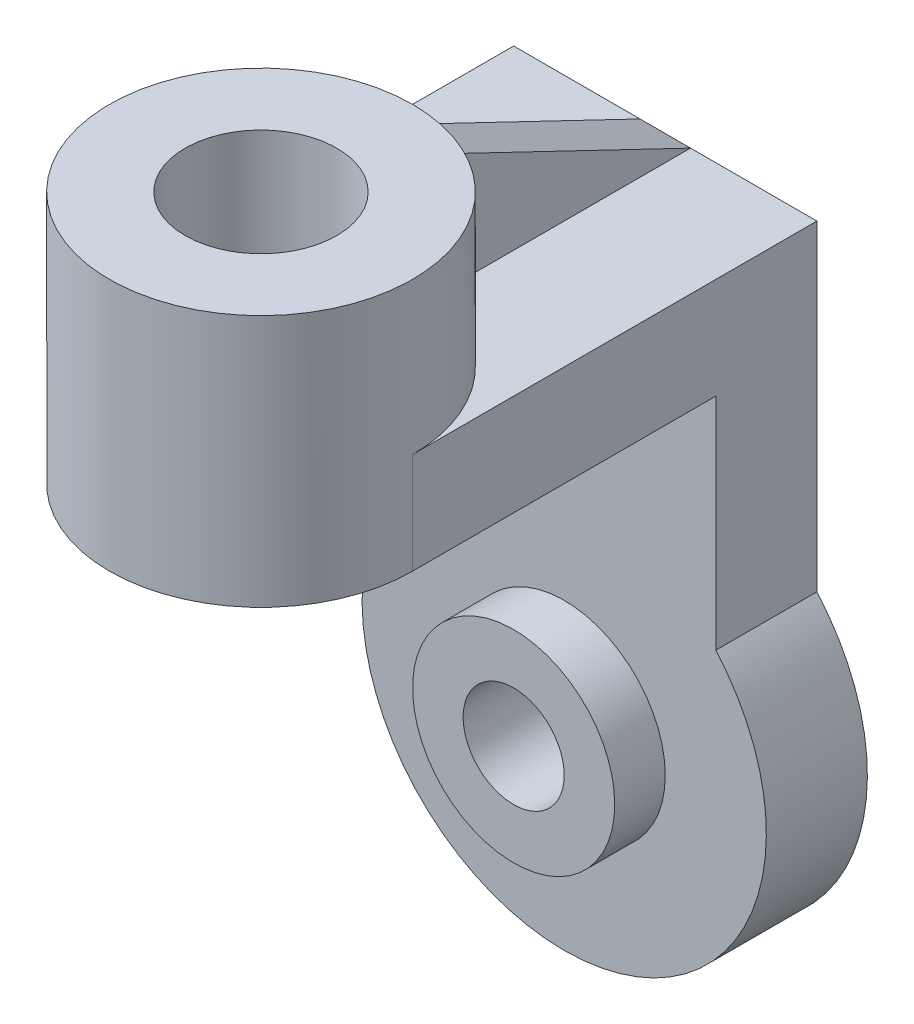
ISO-10303-21;
HEADER;
FILE_DESCRIPTION(('STEP AP214'),'2;1');
FILE_NAME('part.step','',(''),(''),'','','');
FILE_SCHEMA(('AUTOMOTIVE_DESIGN { 1 0 10303 214 1 1 1 1 }'));
ENDSEC;
DATA;
#1=APPLICATION_CONTEXT('core data for automotive mechanical design processes');
#2=APPLICATION_PROTOCOL_DEFINITION('international standard','automotive_design',2000,#1);
#3=PRODUCT_CONTEXT('',#1,'mechanical');
#4=PRODUCT('Part','Part','',(#3));
#5=PRODUCT_RELATED_PRODUCT_CATEGORY('part','',(#4));
#6=PRODUCT_DEFINITION_FORMATION('','',#4);
#7=PRODUCT_DEFINITION_CONTEXT('part definition',#1,'design');
#8=PRODUCT_DEFINITION('design','',#6,#7);
#9=PRODUCT_DEFINITION_SHAPE('','',#8);
#10=(LENGTH_UNIT() NAMED_UNIT(*) SI_UNIT(.MILLI.,.METRE.));
#11=(NAMED_UNIT(*) PLANE_ANGLE_UNIT() SI_UNIT($,.RADIAN.));
#12=(NAMED_UNIT(*) SI_UNIT($,.STERADIAN.) SOLID_ANGLE_UNIT());
#13=UNCERTAINTY_MEASURE_WITH_UNIT(LENGTH_MEASURE(1.E-05),#10,'distance_accuracy_value','');
#14=(GEOMETRIC_REPRESENTATION_CONTEXT(3) GLOBAL_UNCERTAINTY_ASSIGNED_CONTEXT((#13)) GLOBAL_UNIT_ASSIGNED_CONTEXT((#10,
#11,#12)) REPRESENTATION_CONTEXT('',''));
#15=CARTESIAN_POINT('',(0.,0.,0.));
#16=DIRECTION('',(0.,0.,1.));
#17=DIRECTION('',(1.,0.,0.));
#18=AXIS2_PLACEMENT_3D('',#15,#16,#17);
#19=CARTESIAN_POINT('',(0.,45.,0.));
#20=DIRECTION('',(0.,1.,0.));
#21=DIRECTION('',(0.,0.,1.));
#22=AXIS2_PLACEMENT_3D('',#19,#20,#21);
#23=PLANE('',#22);
#24=CARTESIAN_POINT('',(0.,45.,35.));
#25=DIRECTION('',(0.,1.,0.));
#26=DIRECTION('',(0.,0.,1.));
#27=AXIS2_PLACEMENT_3D('',#24,#25,#26);
#28=CIRCLE('',#27,15.);
#29=CARTESIAN_POINT('',(-2.5,45.,20.209800542251));
#30=VERTEX_POINT('',#29);
#31=CARTESIAN_POINT('',(-15.,45.,35.));
#32=VERTEX_POINT('',#31);
#33=EDGE_CURVE('E138',#30,#32,#28,.T.);
#34=ORIENTED_EDGE('',*,*,#33,.F.);
#35=DIRECTION('',(0.,0.,-1.));
#36=VECTOR('',#35,1.);
#37=CARTESIAN_POINT('',(-2.5,45.,0.));
#38=LINE('',#37,#36);
#39=CARTESIAN_POINT('',(-2.5,45.,-5.));
#40=VERTEX_POINT('',#39);
#41=EDGE_CURVE('E52',#30,#40,#38,.T.);
#42=ORIENTED_EDGE('',*,*,#41,.T.);
#43=DIRECTION('',(-1.,0.,0.));
#44=VECTOR('',#43,1.);
#45=CARTESIAN_POINT('',(-15.,45.,-5.));
#46=LINE('',#45,#44);
#47=CARTESIAN_POINT('',(-15.,45.,-5.));
#48=VERTEX_POINT('',#47);
#49=EDGE_CURVE('E136',#40,#48,#46,.T.);
#50=ORIENTED_EDGE('',*,*,#49,.T.);
#51=DIRECTION('',(0.,0.,1.));
#52=VECTOR('',#51,1.);
#53=CARTESIAN_POINT('',(-15.,45.,-5.));
#54=LINE('',#53,#52);
#55=EDGE_CURVE('E150',#48,#32,#54,.T.);
#56=ORIENTED_EDGE('',*,*,#55,.T.);
#57=EDGE_LOOP('',(#34,#42,#50,#56));
#58=FACE_BOUND('',#57,.T.);
#59=ADVANCED_FACE('F35',(#58),#23,.T.);
#60=CARTESIAN_POINT('',(0.,0.,5.));
#61=DIRECTION('',(0.,0.,1.));
#62=DIRECTION('',(1.,0.,0.));
#63=AXIS2_PLACEMENT_3D('',#60,#61,#62);
#64=PLANE('',#63);
#65=CARTESIAN_POINT('',(0.,0.,5.));
#66=DIRECTION('',(0.,0.,1.));
#67=DIRECTION('',(1.,0.,0.));
#68=AXIS2_PLACEMENT_3D('',#65,#66,#67);
#69=CIRCLE('',#68,10.);
#70=CARTESIAN_POINT('',(10.,0.,5.));
#71=VERTEX_POINT('',#70);
#72=EDGE_CURVE('E178',#71,#71,#69,.F.);
#73=ORIENTED_EDGE('',*,*,#72,.T.);
#74=EDGE_LOOP('',(#73));
#75=FACE_BOUND('',#74,.T.);
#76=CARTESIAN_POINT('',(0.,0.,5.));
#77=DIRECTION('',(0.,0.,1.));
#78=DIRECTION('',(1.,0.,0.));
#79=AXIS2_PLACEMENT_3D('',#76,#77,#78);
#80=CIRCLE('',#79,20.);
#81=CARTESIAN_POINT('',(-15.,13.228756555323,5.));
#82=VERTEX_POINT('',#81);
#83=CARTESIAN_POINT('',(15.,13.228756555323,5.));
#84=VERTEX_POINT('',#83);
#85=EDGE_CURVE('E79',#82,#84,#80,.T.);
#86=ORIENTED_EDGE('',*,*,#85,.T.);
#87=DIRECTION('',(0.,1.,0.));
#88=VECTOR('',#87,1.);
#89=CARTESIAN_POINT('',(15.,35.,5.));
#90=LINE('',#89,#88);
#91=CARTESIAN_POINT('',(15.,35.,5.));
#92=VERTEX_POINT('',#91);
#93=EDGE_CURVE('E184',#84,#92,#90,.T.);
#94=ORIENTED_EDGE('',*,*,#93,.T.);
#95=DIRECTION('',(-1.,0.,0.));
#96=VECTOR('',#95,1.);
#97=CARTESIAN_POINT('',(-15.,35.,5.));
#98=LINE('',#97,#96);
#99=CARTESIAN_POINT('',(-15.,35.,5.));
#100=VERTEX_POINT('',#99);
#101=EDGE_CURVE('E61',#92,#100,#98,.T.);
#102=ORIENTED_EDGE('',*,*,#101,.T.);
#103=DIRECTION('',(0.,-1.,0.));
#104=VECTOR('',#103,1.);
#105=CARTESIAN_POINT('',(-15.,35.,5.));
#106=LINE('',#105,#104);
#107=EDGE_CURVE('E185',#100,#82,#106,.T.);
#108=ORIENTED_EDGE('',*,*,#107,.T.);
#109=EDGE_LOOP('',(#86,#94,#102,#108));
#110=FACE_BOUND('',#109,.T.);
#111=ADVANCED_FACE('F197',(#75,#110),#64,.T.);
#112=CARTESIAN_POINT('',(0.,0.,-5.));
#113=DIRECTION('',(0.,0.,1.));
#114=DIRECTION('',(1.,0.,0.));
#115=AXIS2_PLACEMENT_3D('',#112,#113,#114);
#116=PLANE('',#115);
#117=CARTESIAN_POINT('',(0.,0.,-5.));
#118=DIRECTION('',(0.,0.,1.));
#119=DIRECTION('',(1.,0.,0.));
#120=AXIS2_PLACEMENT_3D('',#117,#118,#119);
#121=CIRCLE('',#120,10.);
#122=CARTESIAN_POINT('',(10.,0.,-5.));
#123=VERTEX_POINT('',#122);
#124=EDGE_CURVE('E11',#123,#123,#121,.F.);
#125=ORIENTED_EDGE('',*,*,#124,.F.);
#126=EDGE_LOOP('',(#125));
#127=FACE_BOUND('',#126,.T.);
#128=DIRECTION('',(0.,1.,0.));
#129=VECTOR('',#128,1.);
#130=CARTESIAN_POINT('',(15.,35.,-5.));
#131=LINE('',#130,#129);
#132=CARTESIAN_POINT('',(15.,13.228756555323,-5.));
#133=VERTEX_POINT('',#132);
#134=CARTESIAN_POINT('',(15.,45.,-5.));
#135=VERTEX_POINT('',#134);
#136=EDGE_CURVE('E194',#133,#135,#131,.T.);
#137=ORIENTED_EDGE('',*,*,#136,.F.);
#138=CARTESIAN_POINT('',(0.,0.,-5.));
#139=DIRECTION('',(0.,0.,1.));
#140=DIRECTION('',(1.,0.,0.));
#141=AXIS2_PLACEMENT_3D('',#138,#139,#140);
#142=CIRCLE('',#141,20.);
#143=CARTESIAN_POINT('',(-15.,13.228756555323,-5.));
#144=VERTEX_POINT('',#143);
#145=EDGE_CURVE('E76',#144,#133,#142,.T.);
#146=ORIENTED_EDGE('',*,*,#145,.F.);
#147=DIRECTION('',(0.,-1.,0.));
#148=VECTOR('',#147,1.);
#149=CARTESIAN_POINT('',(-15.,35.,-5.));
#150=LINE('',#149,#148);
#151=EDGE_CURVE('E143',#48,#144,#150,.T.);
#152=ORIENTED_EDGE('',*,*,#151,.F.);
#153=ORIENTED_EDGE('',*,*,#49,.F.);
#154=DIRECTION('',(-1.,0.,0.));
#155=VECTOR('',#154,1.);
#156=CARTESIAN_POINT('',(0.,45.,-5.));
#157=LINE('',#156,#155);
#158=CARTESIAN_POINT('',(2.5,45.,-5.));
#159=VERTEX_POINT('',#158);
#160=EDGE_CURVE('E117',#159,#40,#157,.T.);
#161=ORIENTED_EDGE('',*,*,#160,.F.);
#162=EDGE_CURVE('E145',#135,#159,#46,.T.);
#163=ORIENTED_EDGE('',*,*,#162,.F.);
#164=EDGE_LOOP('',(#137,#146,#152,#153,#161,#163));
#165=FACE_BOUND('',#164,.T.);
#166=ADVANCED_FACE('F141',(#127,#165),#116,.F.);
#167=CARTESIAN_POINT('',(-15.,35.,5.));
#168=DIRECTION('',(1.,0.,0.));
#169=DIRECTION('',(0.,1.,0.));
#170=AXIS2_PLACEMENT_3D('',#167,#168,#169);
#171=PLANE('',#170);
#172=ORIENTED_EDGE('',*,*,#151,.T.);
#173=DIRECTION('',(0.,0.,-1.));
#174=VECTOR('',#173,1.);
#175=CARTESIAN_POINT('',(-15.,13.228756555323,5.));
#176=LINE('',#175,#174);
#177=EDGE_CURVE('E44',#82,#144,#176,.T.);
#178=ORIENTED_EDGE('',*,*,#177,.F.);
#179=ORIENTED_EDGE('',*,*,#107,.F.);
#180=DIRECTION('',(0.,0.,1.));
#181=VECTOR('',#180,1.);
#182=CARTESIAN_POINT('',(-15.,35.,-5.));
#183=LINE('',#182,#181);
#184=CARTESIAN_POINT('',(-15.,35.,35.));
#185=VERTEX_POINT('',#184);
#186=EDGE_CURVE('E159',#100,#185,#183,.T.);
#187=ORIENTED_EDGE('',*,*,#186,.T.);
#188=DIRECTION('',(0.,-1.,0.));
#189=VECTOR('',#188,1.);
#190=CARTESIAN_POINT('',(-15.,45.,35.));
#191=LINE('',#190,#189);
#192=EDGE_CURVE('E165',#32,#185,#191,.T.);
#193=ORIENTED_EDGE('',*,*,#192,.F.);
#194=ORIENTED_EDGE('',*,*,#55,.F.);
#195=EDGE_LOOP('',(#172,#178,#179,#187,#193,#194));
#196=FACE_BOUND('',#195,.T.);
#197=ADVANCED_FACE('F37',(#196),#171,.F.);
#198=CARTESIAN_POINT('',(0.,0.,5.));
#199=DIRECTION('',(0.,0.,-1.));
#200=DIRECTION('',(-1.,0.,0.));
#201=AXIS2_PLACEMENT_3D('',#198,#199,#200);
#202=CYLINDRICAL_SURFACE('',#201,20.);
#203=DIRECTION('',(0.,0.,-1.));
#204=VECTOR('',#203,1.);
#205=CARTESIAN_POINT('',(15.,13.228756555323,5.));
#206=LINE('',#205,#204);
#207=EDGE_CURVE('E191',#84,#133,#206,.T.);
#208=ORIENTED_EDGE('',*,*,#207,.F.);
#209=ORIENTED_EDGE('',*,*,#85,.F.);
#210=ORIENTED_EDGE('',*,*,#177,.T.);
#211=ORIENTED_EDGE('',*,*,#145,.T.);
#212=EDGE_LOOP('',(#208,#209,#210,#211));
#213=FACE_BOUND('',#212,.T.);
#214=ADVANCED_FACE('F291',(#213),#202,.T.);
#215=CARTESIAN_POINT('',(15.,35.,5.));
#216=DIRECTION('',(-1.,0.,0.));
#217=DIRECTION('',(0.,-1.,0.));
#218=AXIS2_PLACEMENT_3D('',#215,#216,#217);
#219=PLANE('',#218);
#220=ORIENTED_EDGE('',*,*,#136,.T.);
#221=DIRECTION('',(0.,0.,-1.));
#222=VECTOR('',#221,1.);
#223=CARTESIAN_POINT('',(15.,45.,-5.));
#224=LINE('',#223,#222);
#225=CARTESIAN_POINT('',(15.,45.,35.));
#226=VERTEX_POINT('',#225);
#227=EDGE_CURVE('E146',#226,#135,#224,.T.);
#228=ORIENTED_EDGE('',*,*,#227,.F.);
#229=DIRECTION('',(0.,-1.,0.));
#230=VECTOR('',#229,1.);
#231=CARTESIAN_POINT('',(15.,45.,35.));
#232=LINE('',#231,#230);
#233=CARTESIAN_POINT('',(15.,35.,35.));
#234=VERTEX_POINT('',#233);
#235=EDGE_CURVE('E148',#226,#234,#232,.T.);
#236=ORIENTED_EDGE('',*,*,#235,.T.);
#237=DIRECTION('',(0.,0.,-1.));
#238=VECTOR('',#237,1.);
#239=CARTESIAN_POINT('',(15.,35.,-5.));
#240=LINE('',#239,#238);
#241=EDGE_CURVE('E163',#234,#92,#240,.T.);
#242=ORIENTED_EDGE('',*,*,#241,.T.);
#243=ORIENTED_EDGE('',*,*,#93,.F.);
#244=ORIENTED_EDGE('',*,*,#207,.T.);
#245=EDGE_LOOP('',(#220,#228,#236,#242,#243,#244));
#246=FACE_BOUND('',#245,.T.);
#247=ADVANCED_FACE('F199',(#246),#219,.F.);
#248=CARTESIAN_POINT('',(0.,0.,-10.));
#249=DIRECTION('',(0.,0.,1.));
#250=DIRECTION('',(1.,0.,0.));
#251=AXIS2_PLACEMENT_3D('',#248,#249,#250);
#252=PLANE('',#251);
#253=CARTESIAN_POINT('',(0.,0.,-10.));
#254=DIRECTION('',(0.,0.,1.));
#255=DIRECTION('',(1.,0.,0.));
#256=AXIS2_PLACEMENT_3D('',#253,#254,#255);
#257=CIRCLE('',#256,5.);
#258=CARTESIAN_POINT('',(5.,0.,-10.));
#259=VERTEX_POINT('',#258);
#260=EDGE_CURVE('E168',#259,#259,#257,.T.);
#261=ORIENTED_EDGE('',*,*,#260,.T.);
#262=EDGE_LOOP('',(#261));
#263=FACE_BOUND('',#262,.T.);
#264=CARTESIAN_POINT('',(0.,0.,-10.));
#265=DIRECTION('',(0.,0.,1.));
#266=DIRECTION('',(1.,0.,0.));
#267=AXIS2_PLACEMENT_3D('',#264,#265,#266);
#268=CIRCLE('',#267,10.);
#269=CARTESIAN_POINT('',(10.,0.,-10.));
#270=VERTEX_POINT('',#269);
#271=EDGE_CURVE('E171',#270,#270,#268,.T.);
#272=ORIENTED_EDGE('',*,*,#271,.F.);
#273=EDGE_LOOP('',(#272));
#274=FACE_BOUND('',#273,.T.);
#275=ADVANCED_FACE('F279',(#263,#274),#252,.F.);
#276=CARTESIAN_POINT('',(0.,0.,10.));
#277=DIRECTION('',(0.,0.,-1.));
#278=DIRECTION('',(-1.,0.,0.));
#279=AXIS2_PLACEMENT_3D('',#276,#277,#278);
#280=CYLINDRICAL_SURFACE('',#279,10.);
#281=ORIENTED_EDGE('',*,*,#271,.T.);
#282=EDGE_LOOP('',(#281));
#283=FACE_BOUND('',#282,.T.);
#284=ORIENTED_EDGE('',*,*,#124,.T.);
#285=EDGE_LOOP('',(#284));
#286=FACE_BOUND('',#285,.T.);
#287=ADVANCED_FACE('F282',(#283,#286),#280,.T.);
#288=ORIENTED_EDGE('',*,*,#72,.F.);
#289=EDGE_LOOP('',(#288));
#290=FACE_BOUND('',#289,.T.);
#291=CARTESIAN_POINT('',(0.,0.,10.));
#292=DIRECTION('',(0.,0.,1.));
#293=DIRECTION('',(1.,0.,0.));
#294=AXIS2_PLACEMENT_3D('',#291,#292,#293);
#295=CIRCLE('',#294,10.);
#296=CARTESIAN_POINT('',(10.,0.,10.));
#297=VERTEX_POINT('',#296);
#298=EDGE_CURVE('E175',#297,#297,#295,.T.);
#299=ORIENTED_EDGE('',*,*,#298,.F.);
#300=EDGE_LOOP('',(#299));
#301=FACE_BOUND('',#300,.T.);
#302=ADVANCED_FACE('F273',(#290,#301),#280,.T.);
#303=CARTESIAN_POINT('',(0.,0.,10.));
#304=DIRECTION('',(0.,0.,1.));
#305=DIRECTION('',(1.,0.,0.));
#306=AXIS2_PLACEMENT_3D('',#303,#304,#305);
#307=PLANE('',#306);
#308=CARTESIAN_POINT('',(0.,0.,10.));
#309=DIRECTION('',(0.,0.,1.));
#310=DIRECTION('',(1.,0.,0.));
#311=AXIS2_PLACEMENT_3D('',#308,#309,#310);
#312=CIRCLE('',#311,5.);
#313=CARTESIAN_POINT('',(5.,0.,10.));
#314=VERTEX_POINT('',#313);
#315=EDGE_CURVE('E172',#314,#314,#312,.T.);
#316=ORIENTED_EDGE('',*,*,#315,.F.);
#317=EDGE_LOOP('',(#316));
#318=FACE_BOUND('',#317,.T.);
#319=ORIENTED_EDGE('',*,*,#298,.T.);
#320=EDGE_LOOP('',(#319));
#321=FACE_BOUND('',#320,.T.);
#322=ADVANCED_FACE('F267',(#318,#321),#307,.T.);
#323=CARTESIAN_POINT('',(0.,0.,-10.));
#324=DIRECTION('',(0.,0.,1.));
#325=DIRECTION('',(1.,0.,0.));
#326=AXIS2_PLACEMENT_3D('',#323,#324,#325);
#327=CYLINDRICAL_SURFACE('',#326,5.);
#328=ORIENTED_EDGE('',*,*,#260,.F.);
#329=EDGE_LOOP('',(#328));
#330=FACE_BOUND('',#329,.T.);
#331=ORIENTED_EDGE('',*,*,#315,.T.);
#332=EDGE_LOOP('',(#331));
#333=FACE_BOUND('',#332,.T.);
#334=ADVANCED_FACE('F263',(#330,#333),#327,.F.);
#335=DIRECTION('',(0.,0.,-1.));
#336=VECTOR('',#335,1.);
#337=CARTESIAN_POINT('',(2.5,45.,0.));
#338=LINE('',#337,#336);
#339=CARTESIAN_POINT('',(2.5,45.,20.209800542251));
#340=VERTEX_POINT('',#339);
#341=EDGE_CURVE('E229',#340,#159,#338,.T.);
#342=ORIENTED_EDGE('',*,*,#341,.F.);
#343=EDGE_CURVE('E164',#226,#340,#28,.T.);
#344=ORIENTED_EDGE('',*,*,#343,.F.);
#345=ORIENTED_EDGE('',*,*,#227,.T.);
#346=ORIENTED_EDGE('',*,*,#162,.T.);
#347=EDGE_LOOP('',(#342,#344,#345,#346));
#348=FACE_BOUND('',#347,.T.);
#349=ADVANCED_FACE('F228',(#348),#23,.T.);
#350=CARTESIAN_POINT('',(0.,35.,0.));
#351=DIRECTION('',(0.,1.,0.));
#352=DIRECTION('',(0.,0.,1.));
#353=AXIS2_PLACEMENT_3D('',#350,#351,#352);
#354=PLANE('',#353);
#355=CARTESIAN_POINT('',(0.,35.,35.));
#356=DIRECTION('',(0.,1.,0.));
#357=DIRECTION('',(0.,0.,1.));
#358=AXIS2_PLACEMENT_3D('',#355,#356,#357);
#359=CIRCLE('',#358,7.5);
#360=CARTESIAN_POINT('',(0.,35.,42.5));
#361=VERTEX_POINT('',#360);
#362=EDGE_CURVE('E213',#361,#361,#359,.T.);
#363=ORIENTED_EDGE('',*,*,#362,.T.);
#364=EDGE_LOOP('',(#363));
#365=FACE_BOUND('',#364,.T.);
#366=CARTESIAN_POINT('',(0.,35.,35.));
#367=DIRECTION('',(0.,-1.,0.));
#368=DIRECTION('',(0.,0.,-1.));
#369=AXIS2_PLACEMENT_3D('',#366,#367,#368);
#370=CIRCLE('',#369,15.);
#371=EDGE_CURVE('E206',#234,#185,#370,.T.);
#372=ORIENTED_EDGE('',*,*,#371,.T.);
#373=ORIENTED_EDGE('',*,*,#186,.F.);
#374=ORIENTED_EDGE('',*,*,#101,.F.);
#375=ORIENTED_EDGE('',*,*,#241,.F.);
#376=EDGE_LOOP('',(#372,#373,#374,#375));
#377=FACE_BOUND('',#376,.T.);
#378=ADVANCED_FACE('F205',(#365,#377),#354,.F.);
#379=CARTESIAN_POINT('',(0.,60.,35.));
#380=DIRECTION('',(0.,-1.,0.));
#381=DIRECTION('',(0.,0.,-1.));
#382=AXIS2_PLACEMENT_3D('',#379,#380,#381);
#383=CYLINDRICAL_SURFACE('',#382,15.);
#384=CARTESIAN_POINT('',(0.,60.,35.));
#385=DIRECTION('',(0.,-1.,0.));
#386=DIRECTION('',(0.,0.,-1.));
#387=AXIS2_PLACEMENT_3D('',#384,#385,#386);
#388=CIRCLE('',#387,15.);
#389=CARTESIAN_POINT('',(0.,60.,20.));
#390=VERTEX_POINT('',#389);
#391=EDGE_CURVE('E212',#390,#390,#388,.T.);
#392=ORIENTED_EDGE('',*,*,#391,.T.);
#393=EDGE_LOOP('',(#392));
#394=FACE_BOUND('',#393,.T.);
#395=ORIENTED_EDGE('',*,*,#192,.T.);
#396=ORIENTED_EDGE('',*,*,#371,.F.);
#397=ORIENTED_EDGE('',*,*,#235,.F.);
#398=ORIENTED_EDGE('',*,*,#343,.T.);
#399=DIRECTION('',(0.,-1.,0.));
#400=VECTOR('',#399,1.);
#401=CARTESIAN_POINT('',(2.5,60.,20.209800542251));
#402=LINE('',#401,#400);
#403=CARTESIAN_POINT('',(2.5,57.1007042602805,20.209800542251));
#404=VERTEX_POINT('',#403);
#405=EDGE_CURVE('E231',#404,#340,#402,.T.);
#406=ORIENTED_EDGE('',*,*,#405,.F.);
#407=CARTESIAN_POINT('',(0.,64.2,35.));
#408=DIRECTION('',(0.,0.901523057468274,-0.432731067584771));
#409=DIRECTION('',(0.,-0.432731067584771,-0.901523057468274));
#410=AXIS2_PLACEMENT_3D('',#407,#408,#409);
#411=ELLIPSE('',#410,16.6385095486345,15.);
#412=CARTESIAN_POINT('',(-2.5,57.1007042602805,20.209800542251));
#413=VERTEX_POINT('',#412);
#414=EDGE_CURVE('E128',#413,#404,#411,.F.);
#415=ORIENTED_EDGE('',*,*,#414,.F.);
#416=DIRECTION('',(0.,-1.,0.));
#417=VECTOR('',#416,1.);
#418=CARTESIAN_POINT('',(-2.5,60.,20.209800542251));
#419=LINE('',#418,#417);
#420=EDGE_CURVE('E131',#413,#30,#419,.T.);
#421=ORIENTED_EDGE('',*,*,#420,.T.);
#422=ORIENTED_EDGE('',*,*,#33,.T.);
#423=EDGE_LOOP('',(#395,#396,#397,#398,#406,#415,#421,#422));
#424=FACE_BOUND('',#423,.T.);
#425=ADVANCED_FACE('F209',(#394,#424),#383,.T.);
#426=CARTESIAN_POINT('',(0.,60.,35.));
#427=DIRECTION('',(0.,-1.,0.));
#428=DIRECTION('',(0.,0.,-1.));
#429=AXIS2_PLACEMENT_3D('',#426,#427,#428);
#430=PLANE('',#429);
#431=CARTESIAN_POINT('',(0.,60.,35.));
#432=DIRECTION('',(0.,1.,0.));
#433=DIRECTION('',(0.,0.,1.));
#434=AXIS2_PLACEMENT_3D('',#431,#432,#433);
#435=CIRCLE('',#434,7.5);
#436=CARTESIAN_POINT('',(0.,60.,42.5));
#437=VERTEX_POINT('',#436);
#438=EDGE_CURVE('E127',#437,#437,#435,.T.);
#439=ORIENTED_EDGE('',*,*,#438,.F.);
#440=EDGE_LOOP('',(#439));
#441=FACE_BOUND('',#440,.T.);
#442=ORIENTED_EDGE('',*,*,#391,.F.);
#443=EDGE_LOOP('',(#442));
#444=FACE_BOUND('',#443,.T.);
#445=ADVANCED_FACE('F242',(#441,#444),#430,.F.);
#446=CARTESIAN_POINT('',(0.,35.,35.));
#447=DIRECTION('',(0.,1.,0.));
#448=DIRECTION('',(0.,0.,1.));
#449=AXIS2_PLACEMENT_3D('',#446,#447,#448);
#450=CYLINDRICAL_SURFACE('',#449,7.5);
#451=ORIENTED_EDGE('',*,*,#362,.F.);
#452=EDGE_LOOP('',(#451));
#453=FACE_BOUND('',#452,.T.);
#454=ORIENTED_EDGE('',*,*,#438,.T.);
#455=EDGE_LOOP('',(#454));
#456=FACE_BOUND('',#455,.T.);
#457=ADVANCED_FACE('F240',(#453,#456),#450,.F.);
#458=CARTESIAN_POINT('',(2.5,20.,20.));
#459=DIRECTION('',(1.,0.,0.));
#460=DIRECTION('',(0.,0.,-1.));
#461=AXIS2_PLACEMENT_3D('',#458,#459,#460);
#462=PLANE('',#461);
#463=DIRECTION('',(0.,0.432731067584771,0.901523057468274));
#464=VECTOR('',#463,1.);
#465=CARTESIAN_POINT('',(2.5,45.,-5.));
#466=LINE('',#465,#464);
#467=EDGE_CURVE('E122',#159,#404,#466,.T.);
#468=ORIENTED_EDGE('',*,*,#467,.T.);
#469=ORIENTED_EDGE('',*,*,#405,.T.);
#470=ORIENTED_EDGE('',*,*,#341,.T.);
#471=EDGE_LOOP('',(#468,#469,#470));
#472=FACE_BOUND('',#471,.T.);
#473=ADVANCED_FACE('F373',(#472),#462,.T.);
#474=CARTESIAN_POINT('',(-2.5,20.,20.));
#475=DIRECTION('',(1.,0.,0.));
#476=DIRECTION('',(0.,0.,-1.));
#477=AXIS2_PLACEMENT_3D('',#474,#475,#476);
#478=PLANE('',#477);
#479=ORIENTED_EDGE('',*,*,#420,.F.);
#480=DIRECTION('',(0.,0.432731067584771,0.901523057468274));
#481=VECTOR('',#480,1.);
#482=CARTESIAN_POINT('',(-2.5,45.,-5.));
#483=LINE('',#482,#481);
#484=EDGE_CURVE('E119',#40,#413,#483,.T.);
#485=ORIENTED_EDGE('',*,*,#484,.F.);
#486=ORIENTED_EDGE('',*,*,#41,.F.);
#487=EDGE_LOOP('',(#479,#485,#486));
#488=FACE_BOUND('',#487,.T.);
#489=ADVANCED_FACE('F130',(#488),#478,.F.);
#490=CARTESIAN_POINT('',(0.,45.,-5.));
#491=DIRECTION('',(0.,0.901523057468274,-0.432731067584771));
#492=DIRECTION('',(0.,0.432731067584771,0.901523057468274));
#493=AXIS2_PLACEMENT_3D('',#490,#491,#492);
#494=PLANE('',#493);
#495=ORIENTED_EDGE('',*,*,#467,.F.);
#496=ORIENTED_EDGE('',*,*,#160,.T.);
#497=ORIENTED_EDGE('',*,*,#484,.T.);
#498=ORIENTED_EDGE('',*,*,#414,.T.);
#499=EDGE_LOOP('',(#495,#496,#497,#498));
#500=FACE_BOUND('',#499,.T.);
#501=ADVANCED_FACE('F118',(#500),#494,.T.);
#502=CLOSED_SHELL('',(#59,#111,#166,#197,#214,#247,#275,#287,#302,#322,#334,#349,#378,#425,#445,
#457,#473,#489,#501));
#503=MANIFOLD_SOLID_BREP('B2',#502);
#504=ADVANCED_BREP_SHAPE_REPRESENTATION('',(#18,#503),#14);
#505=SHAPE_DEFINITION_REPRESENTATION(#9,#504);
ENDSEC;
END-ISO-10303-21;
